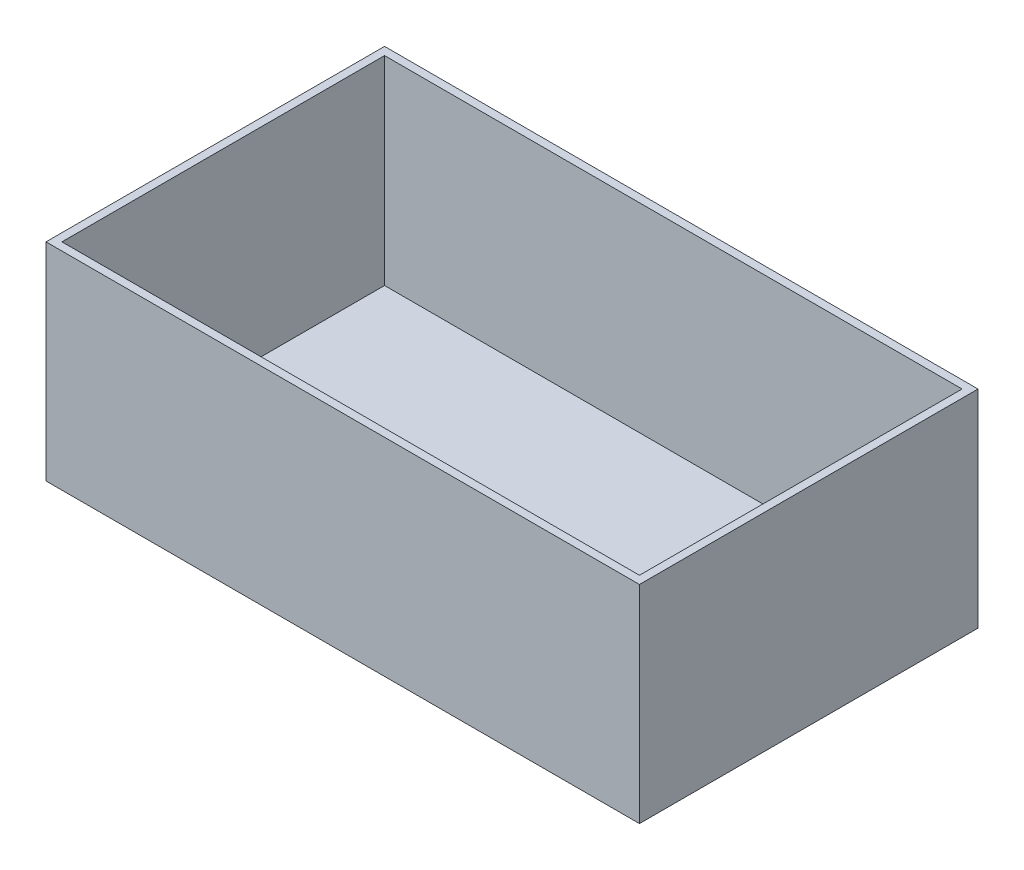
ISO-10303-21;
HEADER;
FILE_DESCRIPTION(('STEP AP214'),'2;1');
FILE_NAME('part.step','',(''),(''),'','','');
FILE_SCHEMA(('AUTOMOTIVE_DESIGN { 1 0 10303 214 1 1 1 1 }'));
ENDSEC;
DATA;
#1=APPLICATION_CONTEXT('core data for automotive mechanical design processes');
#2=APPLICATION_PROTOCOL_DEFINITION('international standard','automotive_design',2000,#1);
#3=PRODUCT_CONTEXT('',#1,'mechanical');
#4=PRODUCT('Part','Part','',(#3));
#5=PRODUCT_RELATED_PRODUCT_CATEGORY('part','',(#4));
#6=PRODUCT_DEFINITION_FORMATION('','',#4);
#7=PRODUCT_DEFINITION_CONTEXT('part definition',#1,'design');
#8=PRODUCT_DEFINITION('design','',#6,#7);
#9=PRODUCT_DEFINITION_SHAPE('','',#8);
#10=(LENGTH_UNIT() NAMED_UNIT(*) SI_UNIT(.MILLI.,.METRE.));
#11=(NAMED_UNIT(*) PLANE_ANGLE_UNIT() SI_UNIT($,.RADIAN.));
#12=(NAMED_UNIT(*) SI_UNIT($,.STERADIAN.) SOLID_ANGLE_UNIT());
#13=UNCERTAINTY_MEASURE_WITH_UNIT(LENGTH_MEASURE(1.E-05),#10,'distance_accuracy_value','');
#14=(GEOMETRIC_REPRESENTATION_CONTEXT(3) GLOBAL_UNCERTAINTY_ASSIGNED_CONTEXT((#13)) GLOBAL_UNIT_ASSIGNED_CONTEXT((#10,
#11,#12)) REPRESENTATION_CONTEXT('',''));
#15=CARTESIAN_POINT('',(0.,0.,0.));
#16=DIRECTION('',(0.,0.,1.));
#17=DIRECTION('',(1.,0.,0.));
#18=AXIS2_PLACEMENT_3D('',#15,#16,#17);
#19=CARTESIAN_POINT('',(-74.5,2.,-42.5));
#20=DIRECTION('',(0.,0.,1.));
#21=DIRECTION('',(1.,0.,0.));
#22=AXIS2_PLACEMENT_3D('',#19,#20,#21);
#23=PLANE('',#22);
#24=DIRECTION('',(-1.,0.,0.));
#25=VECTOR('',#24,1.);
#26=CARTESIAN_POINT('',(-74.5,0.,-42.5));
#27=LINE('',#26,#25);
#28=CARTESIAN_POINT('',(74.5,0.,-42.5));
#29=VERTEX_POINT('',#28);
#30=CARTESIAN_POINT('',(-74.5,0.,-42.5));
#31=VERTEX_POINT('',#30);
#32=EDGE_CURVE('E150',#29,#31,#27,.T.);
#33=ORIENTED_EDGE('',*,*,#32,.T.);
#34=DIRECTION('',(0.,-1.,0.));
#35=VECTOR('',#34,1.);
#36=CARTESIAN_POINT('',(-74.5,2.,-42.5));
#37=LINE('',#36,#35);
#38=CARTESIAN_POINT('',(-74.5,52.,-42.5));
#39=VERTEX_POINT('',#38);
#40=EDGE_CURVE('E11',#39,#31,#37,.T.);
#41=ORIENTED_EDGE('',*,*,#40,.F.);
#42=DIRECTION('',(-1.,0.,0.));
#43=VECTOR('',#42,1.);
#44=CARTESIAN_POINT('',(74.5,52.,-42.5));
#45=LINE('',#44,#43);
#46=CARTESIAN_POINT('',(74.5,52.,-42.5));
#47=VERTEX_POINT('',#46);
#48=EDGE_CURVE('E141',#47,#39,#45,.T.);
#49=ORIENTED_EDGE('',*,*,#48,.F.);
#50=DIRECTION('',(0.,-1.,0.));
#51=VECTOR('',#50,1.);
#52=CARTESIAN_POINT('',(74.5,2.,-42.5));
#53=LINE('',#52,#51);
#54=EDGE_CURVE('E158',#47,#29,#53,.T.);
#55=ORIENTED_EDGE('',*,*,#54,.T.);
#56=EDGE_LOOP('',(#33,#41,#49,#55));
#57=FACE_BOUND('',#56,.T.);
#58=ADVANCED_FACE('F33',(#57),#23,.F.);
#59=CARTESIAN_POINT('',(-74.5,2.,-42.5));
#60=DIRECTION('',(1.,0.,0.));
#61=DIRECTION('',(0.,0.,-1.));
#62=AXIS2_PLACEMENT_3D('',#59,#60,#61);
#63=PLANE('',#62);
#64=DIRECTION('',(0.,0.,1.));
#65=VECTOR('',#64,1.);
#66=CARTESIAN_POINT('',(-74.5,0.,-42.5));
#67=LINE('',#66,#65);
#68=CARTESIAN_POINT('',(-74.5,0.,42.5));
#69=VERTEX_POINT('',#68);
#70=EDGE_CURVE('E153',#31,#69,#67,.T.);
#71=ORIENTED_EDGE('',*,*,#70,.T.);
#72=DIRECTION('',(0.,-1.,0.));
#73=VECTOR('',#72,1.);
#74=CARTESIAN_POINT('',(-74.5,2.,42.5));
#75=LINE('',#74,#73);
#76=CARTESIAN_POINT('',(-74.5,52.,42.5));
#77=VERTEX_POINT('',#76);
#78=EDGE_CURVE('E40',#77,#69,#75,.T.);
#79=ORIENTED_EDGE('',*,*,#78,.F.);
#80=DIRECTION('',(0.,0.,1.));
#81=VECTOR('',#80,1.);
#82=CARTESIAN_POINT('',(-74.5,52.,-42.5));
#83=LINE('',#82,#81);
#84=EDGE_CURVE('E144',#39,#77,#83,.T.);
#85=ORIENTED_EDGE('',*,*,#84,.F.);
#86=ORIENTED_EDGE('',*,*,#40,.T.);
#87=EDGE_LOOP('',(#71,#79,#85,#86));
#88=FACE_BOUND('',#87,.T.);
#89=ADVANCED_FACE('F176',(#88),#63,.F.);
#90=CARTESIAN_POINT('',(-74.5,2.,42.5));
#91=DIRECTION('',(0.,0.,-1.));
#92=DIRECTION('',(-1.,0.,0.));
#93=AXIS2_PLACEMENT_3D('',#90,#91,#92);
#94=PLANE('',#93);
#95=DIRECTION('',(1.,0.,0.));
#96=VECTOR('',#95,1.);
#97=CARTESIAN_POINT('',(-74.5,0.,42.5));
#98=LINE('',#97,#96);
#99=CARTESIAN_POINT('',(74.5,0.,42.5));
#100=VERTEX_POINT('',#99);
#101=EDGE_CURVE('E155',#69,#100,#98,.T.);
#102=ORIENTED_EDGE('',*,*,#101,.T.);
#103=DIRECTION('',(0.,-1.,0.));
#104=VECTOR('',#103,1.);
#105=CARTESIAN_POINT('',(74.5,2.,42.5));
#106=LINE('',#105,#104);
#107=CARTESIAN_POINT('',(74.5,52.,42.5));
#108=VERTEX_POINT('',#107);
#109=EDGE_CURVE('E160',#108,#100,#106,.T.);
#110=ORIENTED_EDGE('',*,*,#109,.F.);
#111=DIRECTION('',(1.,0.,0.));
#112=VECTOR('',#111,1.);
#113=CARTESIAN_POINT('',(-74.5,52.,42.5));
#114=LINE('',#113,#112);
#115=EDGE_CURVE('E147',#77,#108,#114,.T.);
#116=ORIENTED_EDGE('',*,*,#115,.F.);
#117=ORIENTED_EDGE('',*,*,#78,.T.);
#118=EDGE_LOOP('',(#102,#110,#116,#117));
#119=FACE_BOUND('',#118,.T.);
#120=ADVANCED_FACE('F165',(#119),#94,.F.);
#121=CARTESIAN_POINT('',(74.5,2.,-42.5));
#122=DIRECTION('',(-1.,0.,0.));
#123=DIRECTION('',(0.,0.,1.));
#124=AXIS2_PLACEMENT_3D('',#121,#122,#123);
#125=PLANE('',#124);
#126=DIRECTION('',(0.,0.,-1.));
#127=VECTOR('',#126,1.);
#128=CARTESIAN_POINT('',(74.5,0.,-42.5));
#129=LINE('',#128,#127);
#130=EDGE_CURVE('E55',#100,#29,#129,.T.);
#131=ORIENTED_EDGE('',*,*,#130,.T.);
#132=ORIENTED_EDGE('',*,*,#54,.F.);
#133=DIRECTION('',(0.,0.,-1.));
#134=VECTOR('',#133,1.);
#135=CARTESIAN_POINT('',(74.5,52.,42.5));
#136=LINE('',#135,#134);
#137=EDGE_CURVE('E115',#108,#47,#136,.T.);
#138=ORIENTED_EDGE('',*,*,#137,.F.);
#139=ORIENTED_EDGE('',*,*,#109,.T.);
#140=EDGE_LOOP('',(#131,#132,#138,#139));
#141=FACE_BOUND('',#140,.T.);
#142=ADVANCED_FACE('F174',(#141),#125,.F.);
#143=CARTESIAN_POINT('',(0.,0.,0.));
#144=DIRECTION('',(0.,-1.,0.));
#145=DIRECTION('',(0.,0.,-1.));
#146=AXIS2_PLACEMENT_3D('',#143,#144,#145);
#147=PLANE('',#146);
#148=ORIENTED_EDGE('',*,*,#32,.F.);
#149=ORIENTED_EDGE('',*,*,#130,.F.);
#150=ORIENTED_EDGE('',*,*,#101,.F.);
#151=ORIENTED_EDGE('',*,*,#70,.F.);
#152=EDGE_LOOP('',(#148,#149,#150,#151));
#153=FACE_BOUND('',#152,.T.);
#154=ADVANCED_FACE('F170',(#153),#147,.T.);
#155=CARTESIAN_POINT('',(0.,52.,0.));
#156=DIRECTION('',(0.,1.,0.));
#157=DIRECTION('',(0.,0.,1.));
#158=AXIS2_PLACEMENT_3D('',#155,#156,#157);
#159=PLANE('',#158);
#160=ORIENTED_EDGE('',*,*,#137,.T.);
#161=ORIENTED_EDGE('',*,*,#48,.T.);
#162=ORIENTED_EDGE('',*,*,#84,.T.);
#163=ORIENTED_EDGE('',*,*,#115,.T.);
#164=EDGE_LOOP('',(#160,#161,#162,#163));
#165=FACE_BOUND('',#164,.T.);
#166=DIRECTION('',(-1.,0.,0.));
#167=VECTOR('',#166,1.);
#168=CARTESIAN_POINT('',(72.5,52.,-40.5));
#169=LINE('',#168,#167);
#170=CARTESIAN_POINT('',(72.5,52.,-40.5));
#171=VERTEX_POINT('',#170);
#172=CARTESIAN_POINT('',(-72.5,52.,-40.5));
#173=VERTEX_POINT('',#172);
#174=EDGE_CURVE('E107',#171,#173,#169,.T.);
#175=ORIENTED_EDGE('',*,*,#174,.F.);
#176=DIRECTION('',(0.,0.,-1.));
#177=VECTOR('',#176,1.);
#178=CARTESIAN_POINT('',(72.5,52.,40.5));
#179=LINE('',#178,#177);
#180=CARTESIAN_POINT('',(72.5,52.,40.5));
#181=VERTEX_POINT('',#180);
#182=EDGE_CURVE('E99',#181,#171,#179,.T.);
#183=ORIENTED_EDGE('',*,*,#182,.F.);
#184=DIRECTION('',(1.,0.,0.));
#185=VECTOR('',#184,1.);
#186=CARTESIAN_POINT('',(-72.5,52.,40.5));
#187=LINE('',#186,#185);
#188=CARTESIAN_POINT('',(-72.5,52.,40.5));
#189=VERTEX_POINT('',#188);
#190=EDGE_CURVE('E123',#189,#181,#187,.T.);
#191=ORIENTED_EDGE('',*,*,#190,.F.);
#192=DIRECTION('',(0.,0.,1.));
#193=VECTOR('',#192,1.);
#194=CARTESIAN_POINT('',(-72.5,52.,-40.5));
#195=LINE('',#194,#193);
#196=EDGE_CURVE('E121',#173,#189,#195,.T.);
#197=ORIENTED_EDGE('',*,*,#196,.F.);
#198=EDGE_LOOP('',(#175,#183,#191,#197));
#199=FACE_BOUND('',#198,.T.);
#200=ADVANCED_FACE('F119',(#165,#199),#159,.T.);
#201=CARTESIAN_POINT('',(72.5,52.,40.5));
#202=DIRECTION('',(-1.,0.,0.));
#203=DIRECTION('',(0.,0.,1.));
#204=AXIS2_PLACEMENT_3D('',#201,#202,#203);
#205=PLANE('',#204);
#206=DIRECTION('',(0.,0.,-1.));
#207=VECTOR('',#206,1.);
#208=CARTESIAN_POINT('',(72.5,2.,40.5));
#209=LINE('',#208,#207);
#210=CARTESIAN_POINT('',(72.5,2.,40.5));
#211=VERTEX_POINT('',#210);
#212=CARTESIAN_POINT('',(72.5,2.,-40.5));
#213=VERTEX_POINT('',#212);
#214=EDGE_CURVE('E127',#211,#213,#209,.T.);
#215=ORIENTED_EDGE('',*,*,#214,.F.);
#216=DIRECTION('',(0.,-1.,0.));
#217=VECTOR('',#216,1.);
#218=CARTESIAN_POINT('',(72.5,52.,40.5));
#219=LINE('',#218,#217);
#220=EDGE_CURVE('E47',#181,#211,#219,.T.);
#221=ORIENTED_EDGE('',*,*,#220,.F.);
#222=ORIENTED_EDGE('',*,*,#182,.T.);
#223=DIRECTION('',(0.,-1.,0.));
#224=VECTOR('',#223,1.);
#225=CARTESIAN_POINT('',(72.5,52.,-40.5));
#226=LINE('',#225,#224);
#227=EDGE_CURVE('E102',#171,#213,#226,.T.);
#228=ORIENTED_EDGE('',*,*,#227,.T.);
#229=EDGE_LOOP('',(#215,#221,#222,#228));
#230=FACE_BOUND('',#229,.T.);
#231=ADVANCED_FACE('F101',(#230),#205,.T.);
#232=CARTESIAN_POINT('',(72.5,52.,-40.5));
#233=DIRECTION('',(0.,0.,1.));
#234=DIRECTION('',(1.,0.,0.));
#235=AXIS2_PLACEMENT_3D('',#232,#233,#234);
#236=PLANE('',#235);
#237=DIRECTION('',(-1.,0.,0.));
#238=VECTOR('',#237,1.);
#239=CARTESIAN_POINT('',(72.5,2.,-40.5));
#240=LINE('',#239,#238);
#241=CARTESIAN_POINT('',(-72.5,2.,-40.5));
#242=VERTEX_POINT('',#241);
#243=EDGE_CURVE('E114',#213,#242,#240,.T.);
#244=ORIENTED_EDGE('',*,*,#243,.F.);
#245=ORIENTED_EDGE('',*,*,#227,.F.);
#246=ORIENTED_EDGE('',*,*,#174,.T.);
#247=DIRECTION('',(0.,-1.,0.));
#248=VECTOR('',#247,1.);
#249=CARTESIAN_POINT('',(-72.5,52.,-40.5));
#250=LINE('',#249,#248);
#251=EDGE_CURVE('E116',#173,#242,#250,.T.);
#252=ORIENTED_EDGE('',*,*,#251,.T.);
#253=EDGE_LOOP('',(#244,#245,#246,#252));
#254=FACE_BOUND('',#253,.T.);
#255=ADVANCED_FACE('F111',(#254),#236,.T.);
#256=CARTESIAN_POINT('',(-72.5,52.,-40.5));
#257=DIRECTION('',(1.,0.,0.));
#258=DIRECTION('',(0.,0.,-1.));
#259=AXIS2_PLACEMENT_3D('',#256,#257,#258);
#260=PLANE('',#259);
#261=DIRECTION('',(0.,0.,1.));
#262=VECTOR('',#261,1.);
#263=CARTESIAN_POINT('',(-72.5,2.,-40.5));
#264=LINE('',#263,#262);
#265=CARTESIAN_POINT('',(-72.5,2.,40.5));
#266=VERTEX_POINT('',#265);
#267=EDGE_CURVE('E130',#242,#266,#264,.T.);
#268=ORIENTED_EDGE('',*,*,#267,.F.);
#269=ORIENTED_EDGE('',*,*,#251,.F.);
#270=ORIENTED_EDGE('',*,*,#196,.T.);
#271=DIRECTION('',(0.,-1.,0.));
#272=VECTOR('',#271,1.);
#273=CARTESIAN_POINT('',(-72.5,52.,40.5));
#274=LINE('',#273,#272);
#275=EDGE_CURVE('E136',#189,#266,#274,.T.);
#276=ORIENTED_EDGE('',*,*,#275,.T.);
#277=EDGE_LOOP('',(#268,#269,#270,#276));
#278=FACE_BOUND('',#277,.T.);
#279=ADVANCED_FACE('F199',(#278),#260,.T.);
#280=CARTESIAN_POINT('',(-72.5,52.,40.5));
#281=DIRECTION('',(0.,0.,-1.));
#282=DIRECTION('',(-1.,0.,0.));
#283=AXIS2_PLACEMENT_3D('',#280,#281,#282);
#284=PLANE('',#283);
#285=DIRECTION('',(1.,0.,0.));
#286=VECTOR('',#285,1.);
#287=CARTESIAN_POINT('',(-72.5,2.,40.5));
#288=LINE('',#287,#286);
#289=EDGE_CURVE('E108',#266,#211,#288,.T.);
#290=ORIENTED_EDGE('',*,*,#289,.F.);
#291=ORIENTED_EDGE('',*,*,#275,.F.);
#292=ORIENTED_EDGE('',*,*,#190,.T.);
#293=ORIENTED_EDGE('',*,*,#220,.T.);
#294=EDGE_LOOP('',(#290,#291,#292,#293));
#295=FACE_BOUND('',#294,.T.);
#296=ADVANCED_FACE('F191',(#295),#284,.T.);
#297=CARTESIAN_POINT('',(0.,2.,0.));
#298=DIRECTION('',(0.,-1.,0.));
#299=DIRECTION('',(0.,0.,-1.));
#300=AXIS2_PLACEMENT_3D('',#297,#298,#299);
#301=PLANE('',#300);
#302=ORIENTED_EDGE('',*,*,#289,.T.);
#303=ORIENTED_EDGE('',*,*,#214,.T.);
#304=ORIENTED_EDGE('',*,*,#243,.T.);
#305=ORIENTED_EDGE('',*,*,#267,.T.);
#306=EDGE_LOOP('',(#302,#303,#304,#305));
#307=FACE_BOUND('',#306,.T.);
#308=ADVANCED_FACE('F188',(#307),#301,.F.);
#309=CLOSED_SHELL('',(#58,#89,#120,#142,#154,#200,#231,#255,#279,#296,#308));
#310=MANIFOLD_SOLID_BREP('B2',#309);
#311=ADVANCED_BREP_SHAPE_REPRESENTATION('',(#18,#310),#14);
#312=SHAPE_DEFINITION_REPRESENTATION(#9,#311);
ENDSEC;
END-ISO-10303-21;
